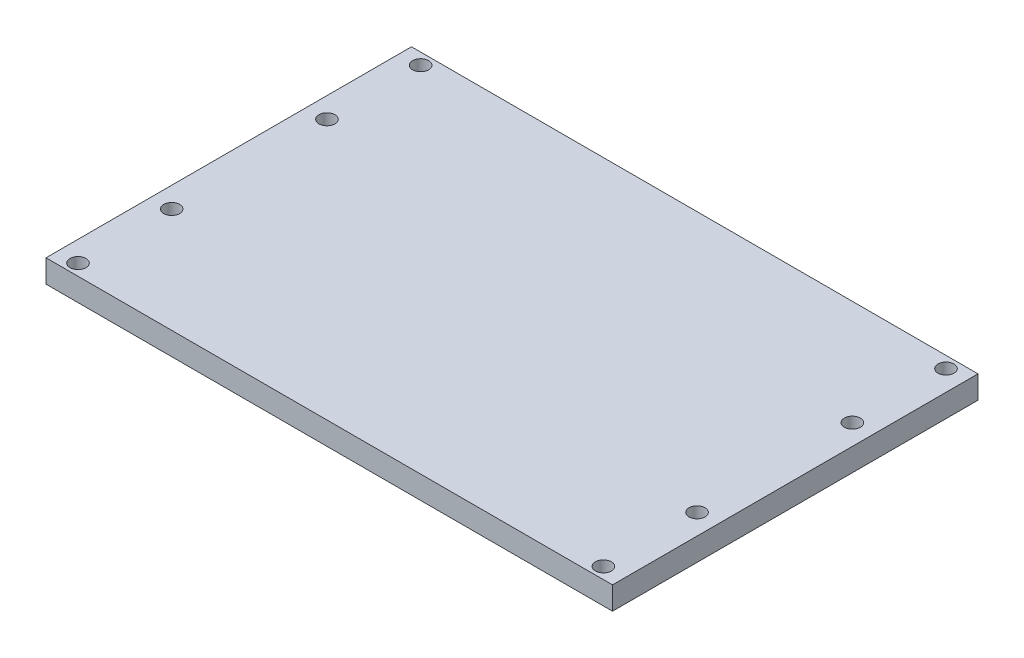
ISO-10303-21;
HEADER;
FILE_DESCRIPTION(('STEP AP214'),'2;1');
FILE_NAME('part.step','',(''),(''),'','','');
FILE_SCHEMA(('AUTOMOTIVE_DESIGN { 1 0 10303 214 1 1 1 1 }'));
ENDSEC;
DATA;
#1=APPLICATION_CONTEXT('core data for automotive mechanical design processes');
#2=APPLICATION_PROTOCOL_DEFINITION('international standard','automotive_design',2000,#1);
#3=PRODUCT_CONTEXT('',#1,'mechanical');
#4=PRODUCT('Part','Part','',(#3));
#5=PRODUCT_RELATED_PRODUCT_CATEGORY('part','',(#4));
#6=PRODUCT_DEFINITION_FORMATION('','',#4);
#7=PRODUCT_DEFINITION_CONTEXT('part definition',#1,'design');
#8=PRODUCT_DEFINITION('design','',#6,#7);
#9=PRODUCT_DEFINITION_SHAPE('','',#8);
#10=(LENGTH_UNIT() NAMED_UNIT(*) SI_UNIT(.MILLI.,.METRE.));
#11=(NAMED_UNIT(*) PLANE_ANGLE_UNIT() SI_UNIT($,.RADIAN.));
#12=(NAMED_UNIT(*) SI_UNIT($,.STERADIAN.) SOLID_ANGLE_UNIT());
#13=UNCERTAINTY_MEASURE_WITH_UNIT(LENGTH_MEASURE(1.E-05),#10,'distance_accuracy_value','');
#14=(GEOMETRIC_REPRESENTATION_CONTEXT(3) GLOBAL_UNCERTAINTY_ASSIGNED_CONTEXT((#13)) GLOBAL_UNIT_ASSIGNED_CONTEXT((#10,
#11,#12)) REPRESENTATION_CONTEXT('',''));
#15=CARTESIAN_POINT('',(0.,0.,0.));
#16=DIRECTION('',(0.,0.,1.));
#17=DIRECTION('',(1.,0.,0.));
#18=AXIS2_PLACEMENT_3D('',#15,#16,#17);
#19=CARTESIAN_POINT('',(-57.5,0.,-17.));
#20=DIRECTION('',(0.,1.,0.));
#21=DIRECTION('',(0.,0.,1.));
#22=AXIS2_PLACEMENT_3D('',#19,#20,#21);
#23=CYLINDRICAL_SURFACE('',#22,1.15);
#24=CARTESIAN_POINT('',(-57.5,0.,-17.));
#25=DIRECTION('',(0.,1.,0.));
#26=DIRECTION('',(0.,0.,1.));
#27=AXIS2_PLACEMENT_3D('',#24,#25,#26);
#28=CIRCLE('',#27,1.15);
#29=CARTESIAN_POINT('',(-57.5,0.,-15.85));
#30=VERTEX_POINT('',#29);
#31=EDGE_CURVE('E109',#30,#30,#28,.T.);
#32=ORIENTED_EDGE('',*,*,#31,.F.);
#33=EDGE_LOOP('',(#32));
#34=FACE_BOUND('',#33,.T.);
#35=CARTESIAN_POINT('',(-57.5,2.,-17.));
#36=DIRECTION('',(0.,1.,0.));
#37=DIRECTION('',(0.,0.,1.));
#38=AXIS2_PLACEMENT_3D('',#35,#36,#37);
#39=CIRCLE('',#38,1.15);
#40=CARTESIAN_POINT('',(-57.5,2.,-15.85));
#41=VERTEX_POINT('',#40);
#42=EDGE_CURVE('E43',#41,#41,#39,.F.);
#43=ORIENTED_EDGE('',*,*,#42,.F.);
#44=EDGE_LOOP('',(#43));
#45=FACE_BOUND('',#44,.T.);
#46=ADVANCED_FACE('F39',(#34,#45),#23,.F.);
#47=CARTESIAN_POINT('',(57.5,0.,37.5));
#48=DIRECTION('',(0.,1.,0.));
#49=DIRECTION('',(0.,0.,1.));
#50=AXIS2_PLACEMENT_3D('',#47,#48,#49);
#51=CYLINDRICAL_SURFACE('',#50,1.15);
#52=CARTESIAN_POINT('',(57.5,0.,37.5));
#53=DIRECTION('',(0.,1.,0.));
#54=DIRECTION('',(0.,0.,1.));
#55=AXIS2_PLACEMENT_3D('',#52,#53,#54);
#56=CIRCLE('',#55,1.15);
#57=CARTESIAN_POINT('',(57.5,0.,38.65));
#58=VERTEX_POINT('',#57);
#59=EDGE_CURVE('E138',#58,#58,#56,.T.);
#60=ORIENTED_EDGE('',*,*,#59,.F.);
#61=EDGE_LOOP('',(#60));
#62=FACE_BOUND('',#61,.T.);
#63=CARTESIAN_POINT('',(57.5,2.,37.5));
#64=DIRECTION('',(0.,1.,0.));
#65=DIRECTION('',(0.,0.,1.));
#66=AXIS2_PLACEMENT_3D('',#63,#64,#65);
#67=CIRCLE('',#66,1.15);
#68=CARTESIAN_POINT('',(57.5,2.,38.65));
#69=VERTEX_POINT('',#68);
#70=EDGE_CURVE('E133',#69,#69,#67,.F.);
#71=ORIENTED_EDGE('',*,*,#70,.F.);
#72=EDGE_LOOP('',(#71));
#73=FACE_BOUND('',#72,.T.);
#74=ADVANCED_FACE('F171',(#62,#73),#51,.F.);
#75=CARTESIAN_POINT('',(57.5,0.,17.));
#76=DIRECTION('',(0.,1.,0.));
#77=DIRECTION('',(0.,0.,1.));
#78=AXIS2_PLACEMENT_3D('',#75,#76,#77);
#79=CYLINDRICAL_SURFACE('',#78,1.15);
#80=CARTESIAN_POINT('',(57.5,0.,17.));
#81=DIRECTION('',(0.,1.,0.));
#82=DIRECTION('',(0.,0.,1.));
#83=AXIS2_PLACEMENT_3D('',#80,#81,#82);
#84=CIRCLE('',#83,1.15);
#85=CARTESIAN_POINT('',(57.5,0.,18.15));
#86=VERTEX_POINT('',#85);
#87=EDGE_CURVE('E142',#86,#86,#84,.T.);
#88=ORIENTED_EDGE('',*,*,#87,.F.);
#89=EDGE_LOOP('',(#88));
#90=FACE_BOUND('',#89,.T.);
#91=CARTESIAN_POINT('',(57.5,2.,17.));
#92=DIRECTION('',(0.,1.,0.));
#93=DIRECTION('',(0.,0.,1.));
#94=AXIS2_PLACEMENT_3D('',#91,#92,#93);
#95=CIRCLE('',#94,1.15);
#96=CARTESIAN_POINT('',(57.5,2.,18.15));
#97=VERTEX_POINT('',#96);
#98=EDGE_CURVE('E131',#97,#97,#95,.F.);
#99=ORIENTED_EDGE('',*,*,#98,.F.);
#100=EDGE_LOOP('',(#99));
#101=FACE_BOUND('',#100,.T.);
#102=ADVANCED_FACE('F176',(#90,#101),#79,.F.);
#103=CARTESIAN_POINT('',(57.5,0.,-17.));
#104=DIRECTION('',(0.,1.,0.));
#105=DIRECTION('',(0.,0.,1.));
#106=AXIS2_PLACEMENT_3D('',#103,#104,#105);
#107=CYLINDRICAL_SURFACE('',#106,1.15);
#108=CARTESIAN_POINT('',(57.5,0.,-17.));
#109=DIRECTION('',(0.,1.,0.));
#110=DIRECTION('',(0.,0.,1.));
#111=AXIS2_PLACEMENT_3D('',#108,#109,#110);
#112=CIRCLE('',#111,1.15);
#113=CARTESIAN_POINT('',(57.5,0.,-15.85));
#114=VERTEX_POINT('',#113);
#115=EDGE_CURVE('E147',#114,#114,#112,.T.);
#116=ORIENTED_EDGE('',*,*,#115,.F.);
#117=EDGE_LOOP('',(#116));
#118=FACE_BOUND('',#117,.T.);
#119=CARTESIAN_POINT('',(57.5,2.,-17.));
#120=DIRECTION('',(0.,1.,0.));
#121=DIRECTION('',(0.,0.,1.));
#122=AXIS2_PLACEMENT_3D('',#119,#120,#121);
#123=CIRCLE('',#122,1.15);
#124=CARTESIAN_POINT('',(57.5,2.,-15.85));
#125=VERTEX_POINT('',#124);
#126=EDGE_CURVE('E128',#125,#125,#123,.F.);
#127=ORIENTED_EDGE('',*,*,#126,.F.);
#128=EDGE_LOOP('',(#127));
#129=FACE_BOUND('',#128,.T.);
#130=ADVANCED_FACE('F221',(#118,#129),#107,.F.);
#131=CARTESIAN_POINT('',(57.5,0.,-37.5));
#132=DIRECTION('',(0.,1.,0.));
#133=DIRECTION('',(0.,0.,1.));
#134=AXIS2_PLACEMENT_3D('',#131,#132,#133);
#135=CYLINDRICAL_SURFACE('',#134,1.15);
#136=CARTESIAN_POINT('',(57.5,0.,-37.5));
#137=DIRECTION('',(0.,1.,0.));
#138=DIRECTION('',(0.,0.,1.));
#139=AXIS2_PLACEMENT_3D('',#136,#137,#138);
#140=CIRCLE('',#139,1.15);
#141=CARTESIAN_POINT('',(57.5,0.,-36.35));
#142=VERTEX_POINT('',#141);
#143=EDGE_CURVE('E160',#142,#142,#140,.T.);
#144=ORIENTED_EDGE('',*,*,#143,.F.);
#145=EDGE_LOOP('',(#144));
#146=FACE_BOUND('',#145,.T.);
#147=CARTESIAN_POINT('',(57.5,2.,-37.5));
#148=DIRECTION('',(0.,1.,0.));
#149=DIRECTION('',(0.,0.,1.));
#150=AXIS2_PLACEMENT_3D('',#147,#148,#149);
#151=CIRCLE('',#150,1.15);
#152=CARTESIAN_POINT('',(57.5,2.,-36.35));
#153=VERTEX_POINT('',#152);
#154=EDGE_CURVE('E125',#153,#153,#151,.F.);
#155=ORIENTED_EDGE('',*,*,#154,.F.);
#156=EDGE_LOOP('',(#155));
#157=FACE_BOUND('',#156,.T.);
#158=ADVANCED_FACE('F181',(#146,#157),#135,.F.);
#159=CARTESIAN_POINT('',(-57.5,0.,-37.5));
#160=DIRECTION('',(0.,1.,0.));
#161=DIRECTION('',(0.,0.,1.));
#162=AXIS2_PLACEMENT_3D('',#159,#160,#161);
#163=CYLINDRICAL_SURFACE('',#162,1.15);
#164=CARTESIAN_POINT('',(-57.5,0.,-37.5));
#165=DIRECTION('',(0.,1.,0.));
#166=DIRECTION('',(0.,0.,1.));
#167=AXIS2_PLACEMENT_3D('',#164,#165,#166);
#168=CIRCLE('',#167,1.15);
#169=CARTESIAN_POINT('',(-57.5,0.,-36.35));
#170=VERTEX_POINT('',#169);
#171=EDGE_CURVE('E157',#170,#170,#168,.T.);
#172=ORIENTED_EDGE('',*,*,#171,.F.);
#173=EDGE_LOOP('',(#172));
#174=FACE_BOUND('',#173,.T.);
#175=CARTESIAN_POINT('',(-57.5,2.,-37.5));
#176=DIRECTION('',(0.,1.,0.));
#177=DIRECTION('',(0.,0.,1.));
#178=AXIS2_PLACEMENT_3D('',#175,#176,#177);
#179=CIRCLE('',#178,1.15);
#180=CARTESIAN_POINT('',(-57.5,2.,-36.35));
#181=VERTEX_POINT('',#180);
#182=EDGE_CURVE('E122',#181,#181,#179,.F.);
#183=ORIENTED_EDGE('',*,*,#182,.F.);
#184=EDGE_LOOP('',(#183));
#185=FACE_BOUND('',#184,.T.);
#186=ADVANCED_FACE('F210',(#174,#185),#163,.F.);
#187=CARTESIAN_POINT('',(-57.5,0.,37.5));
#188=DIRECTION('',(0.,1.,0.));
#189=DIRECTION('',(0.,0.,1.));
#190=AXIS2_PLACEMENT_3D('',#187,#188,#189);
#191=CYLINDRICAL_SURFACE('',#190,1.15);
#192=CARTESIAN_POINT('',(-57.5,0.,37.5));
#193=DIRECTION('',(0.,1.,0.));
#194=DIRECTION('',(0.,0.,1.));
#195=AXIS2_PLACEMENT_3D('',#192,#193,#194);
#196=CIRCLE('',#195,1.15);
#197=CARTESIAN_POINT('',(-57.5,0.,38.65));
#198=VERTEX_POINT('',#197);
#199=EDGE_CURVE('E154',#198,#198,#196,.T.);
#200=ORIENTED_EDGE('',*,*,#199,.F.);
#201=EDGE_LOOP('',(#200));
#202=FACE_BOUND('',#201,.T.);
#203=CARTESIAN_POINT('',(-57.5,2.,37.5));
#204=DIRECTION('',(0.,1.,0.));
#205=DIRECTION('',(0.,0.,1.));
#206=AXIS2_PLACEMENT_3D('',#203,#204,#205);
#207=CIRCLE('',#206,1.15);
#208=CARTESIAN_POINT('',(-57.5,2.,38.65));
#209=VERTEX_POINT('',#208);
#210=EDGE_CURVE('E118',#209,#209,#207,.F.);
#211=ORIENTED_EDGE('',*,*,#210,.F.);
#212=EDGE_LOOP('',(#211));
#213=FACE_BOUND('',#212,.T.);
#214=ADVANCED_FACE('F203',(#202,#213),#191,.F.);
#215=CARTESIAN_POINT('',(-57.5,0.,17.));
#216=DIRECTION('',(0.,1.,0.));
#217=DIRECTION('',(0.,0.,1.));
#218=AXIS2_PLACEMENT_3D('',#215,#216,#217);
#219=CYLINDRICAL_SURFACE('',#218,1.15);
#220=CARTESIAN_POINT('',(-57.5,0.,17.));
#221=DIRECTION('',(0.,1.,0.));
#222=DIRECTION('',(0.,0.,1.));
#223=AXIS2_PLACEMENT_3D('',#220,#221,#222);
#224=CIRCLE('',#223,1.15);
#225=CARTESIAN_POINT('',(-57.5,0.,18.15));
#226=VERTEX_POINT('',#225);
#227=EDGE_CURVE('E151',#226,#226,#224,.T.);
#228=ORIENTED_EDGE('',*,*,#227,.F.);
#229=EDGE_LOOP('',(#228));
#230=FACE_BOUND('',#229,.T.);
#231=CARTESIAN_POINT('',(-57.5,2.,17.));
#232=DIRECTION('',(0.,1.,0.));
#233=DIRECTION('',(0.,0.,1.));
#234=AXIS2_PLACEMENT_3D('',#231,#232,#233);
#235=CIRCLE('',#234,1.15);
#236=CARTESIAN_POINT('',(-57.5,2.,18.15));
#237=VERTEX_POINT('',#236);
#238=EDGE_CURVE('E115',#237,#237,#235,.F.);
#239=ORIENTED_EDGE('',*,*,#238,.F.);
#240=EDGE_LOOP('',(#239));
#241=FACE_BOUND('',#240,.T.);
#242=ADVANCED_FACE('F198',(#230,#241),#219,.F.);
#243=CARTESIAN_POINT('',(62.,5.,40.));
#244=DIRECTION('',(-1.,0.,0.));
#245=DIRECTION('',(0.,0.,1.));
#246=AXIS2_PLACEMENT_3D('',#243,#244,#245);
#247=PLANE('',#246);
#248=DIRECTION('',(0.,0.,-1.));
#249=VECTOR('',#248,1.);
#250=CARTESIAN_POINT('',(62.,0.,40.));
#251=LINE('',#250,#249);
#252=CARTESIAN_POINT('',(62.,0.,40.));
#253=VERTEX_POINT('',#252);
#254=CARTESIAN_POINT('',(62.,0.,-40.));
#255=VERTEX_POINT('',#254);
#256=EDGE_CURVE('E106',#253,#255,#251,.T.);
#257=ORIENTED_EDGE('',*,*,#256,.T.);
#258=DIRECTION('',(0.,-1.,0.));
#259=VECTOR('',#258,1.);
#260=CARTESIAN_POINT('',(62.,5.,-40.));
#261=LINE('',#260,#259);
#262=CARTESIAN_POINT('',(62.,5.,-40.));
#263=VERTEX_POINT('',#262);
#264=EDGE_CURVE('E11',#263,#255,#261,.T.);
#265=ORIENTED_EDGE('',*,*,#264,.F.);
#266=DIRECTION('',(0.,0.,-1.));
#267=VECTOR('',#266,1.);
#268=CARTESIAN_POINT('',(62.,5.,40.));
#269=LINE('',#268,#267);
#270=CARTESIAN_POINT('',(62.,5.,40.));
#271=VERTEX_POINT('',#270);
#272=EDGE_CURVE('E93',#271,#263,#269,.T.);
#273=ORIENTED_EDGE('',*,*,#272,.F.);
#274=DIRECTION('',(0.,-1.,0.));
#275=VECTOR('',#274,1.);
#276=CARTESIAN_POINT('',(62.,5.,40.));
#277=LINE('',#276,#275);
#278=EDGE_CURVE('E102',#271,#253,#277,.T.);
#279=ORIENTED_EDGE('',*,*,#278,.T.);
#280=EDGE_LOOP('',(#257,#265,#273,#279));
#281=FACE_BOUND('',#280,.T.);
#282=ADVANCED_FACE('F41',(#281),#247,.F.);
#283=CARTESIAN_POINT('',(-62.,5.,-40.));
#284=DIRECTION('',(0.,0.,1.));
#285=DIRECTION('',(1.,0.,0.));
#286=AXIS2_PLACEMENT_3D('',#283,#284,#285);
#287=PLANE('',#286);
#288=DIRECTION('',(-1.,0.,0.));
#289=VECTOR('',#288,1.);
#290=CARTESIAN_POINT('',(-62.,0.,-40.));
#291=LINE('',#290,#289);
#292=CARTESIAN_POINT('',(-62.,0.,-40.));
#293=VERTEX_POINT('',#292);
#294=EDGE_CURVE('E97',#255,#293,#291,.T.);
#295=ORIENTED_EDGE('',*,*,#294,.T.);
#296=DIRECTION('',(0.,-1.,0.));
#297=VECTOR('',#296,1.);
#298=CARTESIAN_POINT('',(-62.,5.,-40.));
#299=LINE('',#298,#297);
#300=CARTESIAN_POINT('',(-62.,5.,-40.));
#301=VERTEX_POINT('',#300);
#302=EDGE_CURVE('E49',#301,#293,#299,.T.);
#303=ORIENTED_EDGE('',*,*,#302,.F.);
#304=DIRECTION('',(-1.,0.,0.));
#305=VECTOR('',#304,1.);
#306=CARTESIAN_POINT('',(-62.,5.,-40.));
#307=LINE('',#306,#305);
#308=EDGE_CURVE('E88',#263,#301,#307,.T.);
#309=ORIENTED_EDGE('',*,*,#308,.F.);
#310=ORIENTED_EDGE('',*,*,#264,.T.);
#311=EDGE_LOOP('',(#295,#303,#309,#310));
#312=FACE_BOUND('',#311,.T.);
#313=ADVANCED_FACE('F96',(#312),#287,.F.);
#314=CARTESIAN_POINT('',(-62.,5.,40.));
#315=DIRECTION('',(1.,0.,0.));
#316=DIRECTION('',(0.,0.,-1.));
#317=AXIS2_PLACEMENT_3D('',#314,#315,#316);
#318=PLANE('',#317);
#319=DIRECTION('',(0.,0.,1.));
#320=VECTOR('',#319,1.);
#321=CARTESIAN_POINT('',(-62.,0.,40.));
#322=LINE('',#321,#320);
#323=CARTESIAN_POINT('',(-62.,0.,40.));
#324=VERTEX_POINT('',#323);
#325=EDGE_CURVE('E75',#293,#324,#322,.T.);
#326=ORIENTED_EDGE('',*,*,#325,.T.);
#327=DIRECTION('',(0.,-1.,0.));
#328=VECTOR('',#327,1.);
#329=CARTESIAN_POINT('',(-62.,5.,40.));
#330=LINE('',#329,#328);
#331=CARTESIAN_POINT('',(-62.,5.,40.));
#332=VERTEX_POINT('',#331);
#333=EDGE_CURVE('E98',#332,#324,#330,.T.);
#334=ORIENTED_EDGE('',*,*,#333,.F.);
#335=DIRECTION('',(0.,0.,1.));
#336=VECTOR('',#335,1.);
#337=CARTESIAN_POINT('',(-62.,5.,40.));
#338=LINE('',#337,#336);
#339=EDGE_CURVE('E91',#301,#332,#338,.T.);
#340=ORIENTED_EDGE('',*,*,#339,.F.);
#341=ORIENTED_EDGE('',*,*,#302,.T.);
#342=EDGE_LOOP('',(#326,#334,#340,#341));
#343=FACE_BOUND('',#342,.T.);
#344=ADVANCED_FACE('F100',(#343),#318,.F.);
#345=CARTESIAN_POINT('',(-62.,5.,40.));
#346=DIRECTION('',(0.,0.,-1.));
#347=DIRECTION('',(-1.,0.,0.));
#348=AXIS2_PLACEMENT_3D('',#345,#346,#347);
#349=PLANE('',#348);
#350=DIRECTION('',(1.,0.,0.));
#351=VECTOR('',#350,1.);
#352=CARTESIAN_POINT('',(-62.,0.,40.));
#353=LINE('',#352,#351);
#354=EDGE_CURVE('E81',#324,#253,#353,.T.);
#355=ORIENTED_EDGE('',*,*,#354,.T.);
#356=ORIENTED_EDGE('',*,*,#278,.F.);
#357=DIRECTION('',(1.,0.,0.));
#358=VECTOR('',#357,1.);
#359=CARTESIAN_POINT('',(-62.,5.,40.));
#360=LINE('',#359,#358);
#361=EDGE_CURVE('E58',#332,#271,#360,.T.);
#362=ORIENTED_EDGE('',*,*,#361,.F.);
#363=ORIENTED_EDGE('',*,*,#333,.T.);
#364=EDGE_LOOP('',(#355,#356,#362,#363));
#365=FACE_BOUND('',#364,.T.);
#366=ADVANCED_FACE('F185',(#365),#349,.F.);
#367=CARTESIAN_POINT('',(0.,5.,0.));
#368=DIRECTION('',(0.,-1.,0.));
#369=DIRECTION('',(0.,0.,-1.));
#370=AXIS2_PLACEMENT_3D('',#367,#368,#369);
#371=PLANE('',#370);
#372=CARTESIAN_POINT('',(-57.5,5.,-17.));
#373=DIRECTION('',(0.,1.,0.));
#374=DIRECTION('',(0.,0.,1.));
#375=AXIS2_PLACEMENT_3D('',#372,#373,#374);
#376=CIRCLE('',#375,1.75);
#377=CARTESIAN_POINT('',(-57.5,5.,-15.25));
#378=VERTEX_POINT('',#377);
#379=EDGE_CURVE('E329',#378,#378,#376,.T.);
#380=ORIENTED_EDGE('',*,*,#379,.F.);
#381=EDGE_LOOP('',(#380));
#382=FACE_BOUND('',#381,.T.);
#383=CARTESIAN_POINT('',(-57.5,5.,17.));
#384=DIRECTION('',(0.,1.,0.));
#385=DIRECTION('',(0.,0.,1.));
#386=AXIS2_PLACEMENT_3D('',#383,#384,#385);
#387=CIRCLE('',#386,1.75);
#388=CARTESIAN_POINT('',(-57.5,5.,18.75));
#389=VERTEX_POINT('',#388);
#390=EDGE_CURVE('E345',#389,#389,#387,.T.);
#391=ORIENTED_EDGE('',*,*,#390,.F.);
#392=EDGE_LOOP('',(#391));
#393=FACE_BOUND('',#392,.T.);
#394=CARTESIAN_POINT('',(-57.5,5.,37.5));
#395=DIRECTION('',(0.,1.,0.));
#396=DIRECTION('',(0.,0.,1.));
#397=AXIS2_PLACEMENT_3D('',#394,#395,#396);
#398=CIRCLE('',#397,1.75);
#399=CARTESIAN_POINT('',(-57.5,5.,39.25));
#400=VERTEX_POINT('',#399);
#401=EDGE_CURVE('E320',#400,#400,#398,.T.);
#402=ORIENTED_EDGE('',*,*,#401,.F.);
#403=EDGE_LOOP('',(#402));
#404=FACE_BOUND('',#403,.T.);
#405=CARTESIAN_POINT('',(57.5,5.,37.5));
#406=DIRECTION('',(0.,1.,0.));
#407=DIRECTION('',(0.,0.,1.));
#408=AXIS2_PLACEMENT_3D('',#405,#406,#407);
#409=CIRCLE('',#408,1.75);
#410=CARTESIAN_POINT('',(57.5,5.,39.25));
#411=VERTEX_POINT('',#410);
#412=EDGE_CURVE('E315',#411,#411,#409,.T.);
#413=ORIENTED_EDGE('',*,*,#412,.F.);
#414=EDGE_LOOP('',(#413));
#415=FACE_BOUND('',#414,.T.);
#416=CARTESIAN_POINT('',(57.5,5.,17.));
#417=DIRECTION('',(0.,1.,0.));
#418=DIRECTION('',(0.,0.,1.));
#419=AXIS2_PLACEMENT_3D('',#416,#417,#418);
#420=CIRCLE('',#419,1.75);
#421=CARTESIAN_POINT('',(57.5,5.,18.75));
#422=VERTEX_POINT('',#421);
#423=EDGE_CURVE('E322',#422,#422,#420,.T.);
#424=ORIENTED_EDGE('',*,*,#423,.F.);
#425=EDGE_LOOP('',(#424));
#426=FACE_BOUND('',#425,.T.);
#427=CARTESIAN_POINT('',(57.5,5.,-17.));
#428=DIRECTION('',(0.,1.,0.));
#429=DIRECTION('',(0.,0.,1.));
#430=AXIS2_PLACEMENT_3D('',#427,#428,#429);
#431=CIRCLE('',#430,1.75);
#432=CARTESIAN_POINT('',(57.5,5.,-15.25));
#433=VERTEX_POINT('',#432);
#434=EDGE_CURVE('E366',#433,#433,#431,.T.);
#435=ORIENTED_EDGE('',*,*,#434,.F.);
#436=EDGE_LOOP('',(#435));
#437=FACE_BOUND('',#436,.T.);
#438=CARTESIAN_POINT('',(57.5,5.,-37.5));
#439=DIRECTION('',(0.,1.,0.));
#440=DIRECTION('',(0.,0.,1.));
#441=AXIS2_PLACEMENT_3D('',#438,#439,#440);
#442=CIRCLE('',#441,1.75);
#443=CARTESIAN_POINT('',(57.5,5.,-35.75));
#444=VERTEX_POINT('',#443);
#445=EDGE_CURVE('E370',#444,#444,#442,.T.);
#446=ORIENTED_EDGE('',*,*,#445,.F.);
#447=EDGE_LOOP('',(#446));
#448=FACE_BOUND('',#447,.T.);
#449=CARTESIAN_POINT('',(-57.5,5.,-37.5));
#450=DIRECTION('',(0.,1.,0.));
#451=DIRECTION('',(0.,0.,1.));
#452=AXIS2_PLACEMENT_3D('',#449,#450,#451);
#453=CIRCLE('',#452,1.75);
#454=CARTESIAN_POINT('',(-57.5,5.,-35.75));
#455=VERTEX_POINT('',#454);
#456=EDGE_CURVE('E327',#455,#455,#453,.T.);
#457=ORIENTED_EDGE('',*,*,#456,.F.);
#458=EDGE_LOOP('',(#457));
#459=FACE_BOUND('',#458,.T.);
#460=ORIENTED_EDGE('',*,*,#272,.T.);
#461=ORIENTED_EDGE('',*,*,#308,.T.);
#462=ORIENTED_EDGE('',*,*,#339,.T.);
#463=ORIENTED_EDGE('',*,*,#361,.T.);
#464=EDGE_LOOP('',(#460,#461,#462,#463));
#465=FACE_BOUND('',#464,.T.);
#466=ADVANCED_FACE('F89',(#382,#393,#404,#415,#426,#437,#448,#459,#465),#371,.F.);
#467=CARTESIAN_POINT('',(0.,0.,0.));
#468=DIRECTION('',(0.,-1.,0.));
#469=DIRECTION('',(0.,0.,-1.));
#470=AXIS2_PLACEMENT_3D('',#467,#468,#469);
#471=PLANE('',#470);
#472=ORIENTED_EDGE('',*,*,#227,.T.);
#473=EDGE_LOOP('',(#472));
#474=FACE_BOUND('',#473,.T.);
#475=ORIENTED_EDGE('',*,*,#199,.T.);
#476=EDGE_LOOP('',(#475));
#477=FACE_BOUND('',#476,.T.);
#478=ORIENTED_EDGE('',*,*,#171,.T.);
#479=EDGE_LOOP('',(#478));
#480=FACE_BOUND('',#479,.T.);
#481=ORIENTED_EDGE('',*,*,#143,.T.);
#482=EDGE_LOOP('',(#481));
#483=FACE_BOUND('',#482,.T.);
#484=ORIENTED_EDGE('',*,*,#115,.T.);
#485=EDGE_LOOP('',(#484));
#486=FACE_BOUND('',#485,.T.);
#487=ORIENTED_EDGE('',*,*,#87,.T.);
#488=EDGE_LOOP('',(#487));
#489=FACE_BOUND('',#488,.T.);
#490=ORIENTED_EDGE('',*,*,#59,.T.);
#491=EDGE_LOOP('',(#490));
#492=FACE_BOUND('',#491,.T.);
#493=ORIENTED_EDGE('',*,*,#31,.T.);
#494=EDGE_LOOP('',(#493));
#495=FACE_BOUND('',#494,.T.);
#496=ORIENTED_EDGE('',*,*,#256,.F.);
#497=ORIENTED_EDGE('',*,*,#354,.F.);
#498=ORIENTED_EDGE('',*,*,#325,.F.);
#499=ORIENTED_EDGE('',*,*,#294,.F.);
#500=EDGE_LOOP('',(#496,#497,#498,#499));
#501=FACE_BOUND('',#500,.T.);
#502=ADVANCED_FACE('F166',(#474,#477,#480,#483,#486,#489,#492,#495,#501),#471,.T.);
#503=CARTESIAN_POINT('',(-57.5,2.,17.));
#504=DIRECTION('',(0.,1.,0.));
#505=DIRECTION('',(0.,0.,1.));
#506=AXIS2_PLACEMENT_3D('',#503,#504,#505);
#507=PLANE('',#506);
#508=CARTESIAN_POINT('',(-57.5,2.,17.));
#509=DIRECTION('',(0.,1.,0.));
#510=DIRECTION('',(0.,0.,1.));
#511=AXIS2_PLACEMENT_3D('',#508,#509,#510);
#512=CIRCLE('',#511,1.75);
#513=CARTESIAN_POINT('',(-57.5,2.,18.75));
#514=VERTEX_POINT('',#513);
#515=EDGE_CURVE('E353',#514,#514,#512,.T.);
#516=ORIENTED_EDGE('',*,*,#515,.T.);
#517=EDGE_LOOP('',(#516));
#518=FACE_BOUND('',#517,.T.);
#519=ORIENTED_EDGE('',*,*,#238,.T.);
#520=EDGE_LOOP('',(#519));
#521=FACE_BOUND('',#520,.T.);
#522=ADVANCED_FACE('F189',(#518,#521),#507,.T.);
#523=CARTESIAN_POINT('',(-57.5,2.,17.));
#524=DIRECTION('',(0.,1.,0.));
#525=DIRECTION('',(0.,0.,1.));
#526=AXIS2_PLACEMENT_3D('',#523,#524,#525);
#527=CYLINDRICAL_SURFACE('',#526,1.75);
#528=ORIENTED_EDGE('',*,*,#515,.F.);
#529=EDGE_LOOP('',(#528));
#530=FACE_BOUND('',#529,.T.);
#531=ORIENTED_EDGE('',*,*,#390,.T.);
#532=EDGE_LOOP('',(#531));
#533=FACE_BOUND('',#532,.T.);
#534=ADVANCED_FACE('F294',(#530,#533),#527,.F.);
#535=CARTESIAN_POINT('',(-57.5,2.,37.5));
#536=DIRECTION('',(0.,1.,0.));
#537=DIRECTION('',(0.,0.,1.));
#538=AXIS2_PLACEMENT_3D('',#535,#536,#537);
#539=PLANE('',#538);
#540=CARTESIAN_POINT('',(-57.5,2.,37.5));
#541=DIRECTION('',(0.,1.,0.));
#542=DIRECTION('',(0.,0.,1.));
#543=AXIS2_PLACEMENT_3D('',#540,#541,#542);
#544=CIRCLE('',#543,1.75);
#545=CARTESIAN_POINT('',(-57.5,2.,39.25));
#546=VERTEX_POINT('',#545);
#547=EDGE_CURVE('E317',#546,#546,#544,.T.);
#548=ORIENTED_EDGE('',*,*,#547,.T.);
#549=EDGE_LOOP('',(#548));
#550=FACE_BOUND('',#549,.T.);
#551=ORIENTED_EDGE('',*,*,#210,.T.);
#552=EDGE_LOOP('',(#551));
#553=FACE_BOUND('',#552,.T.);
#554=ADVANCED_FACE('F240',(#550,#553),#539,.T.);
#555=CARTESIAN_POINT('',(-57.5,2.,37.5));
#556=DIRECTION('',(0.,1.,0.));
#557=DIRECTION('',(0.,0.,1.));
#558=AXIS2_PLACEMENT_3D('',#555,#556,#557);
#559=CYLINDRICAL_SURFACE('',#558,1.75);
#560=ORIENTED_EDGE('',*,*,#547,.F.);
#561=EDGE_LOOP('',(#560));
#562=FACE_BOUND('',#561,.T.);
#563=ORIENTED_EDGE('',*,*,#401,.T.);
#564=EDGE_LOOP('',(#563));
#565=FACE_BOUND('',#564,.T.);
#566=ADVANCED_FACE('F230',(#562,#565),#559,.F.);
#567=CARTESIAN_POINT('',(-57.5,2.,-37.5));
#568=DIRECTION('',(0.,1.,0.));
#569=DIRECTION('',(0.,0.,1.));
#570=AXIS2_PLACEMENT_3D('',#567,#568,#569);
#571=PLANE('',#570);
#572=CARTESIAN_POINT('',(-57.5,2.,-37.5));
#573=DIRECTION('',(0.,1.,0.));
#574=DIRECTION('',(0.,0.,1.));
#575=AXIS2_PLACEMENT_3D('',#572,#573,#574);
#576=CIRCLE('',#575,1.75);
#577=CARTESIAN_POINT('',(-57.5,2.,-35.75));
#578=VERTEX_POINT('',#577);
#579=EDGE_CURVE('E119',#578,#578,#576,.T.);
#580=ORIENTED_EDGE('',*,*,#579,.T.);
#581=EDGE_LOOP('',(#580));
#582=FACE_BOUND('',#581,.T.);
#583=ORIENTED_EDGE('',*,*,#182,.T.);
#584=EDGE_LOOP('',(#583));
#585=FACE_BOUND('',#584,.T.);
#586=ADVANCED_FACE('F227',(#582,#585),#571,.T.);
#587=CARTESIAN_POINT('',(-57.5,2.,-37.5));
#588=DIRECTION('',(0.,1.,0.));
#589=DIRECTION('',(0.,0.,1.));
#590=AXIS2_PLACEMENT_3D('',#587,#588,#589);
#591=CYLINDRICAL_SURFACE('',#590,1.75);
#592=ORIENTED_EDGE('',*,*,#579,.F.);
#593=EDGE_LOOP('',(#592));
#594=FACE_BOUND('',#593,.T.);
#595=ORIENTED_EDGE('',*,*,#456,.T.);
#596=EDGE_LOOP('',(#595));
#597=FACE_BOUND('',#596,.T.);
#598=ADVANCED_FACE('F229',(#594,#597),#591,.F.);
#599=CARTESIAN_POINT('',(57.5,2.,-37.5));
#600=DIRECTION('',(0.,1.,0.));
#601=DIRECTION('',(0.,0.,1.));
#602=AXIS2_PLACEMENT_3D('',#599,#600,#601);
#603=PLANE('',#602);
#604=CARTESIAN_POINT('',(57.5,2.,-37.5));
#605=DIRECTION('',(0.,1.,0.));
#606=DIRECTION('',(0.,0.,1.));
#607=AXIS2_PLACEMENT_3D('',#604,#605,#606);
#608=CIRCLE('',#607,1.75);
#609=CARTESIAN_POINT('',(57.5,2.,-35.75));
#610=VERTEX_POINT('',#609);
#611=EDGE_CURVE('E348',#610,#610,#608,.T.);
#612=ORIENTED_EDGE('',*,*,#611,.T.);
#613=EDGE_LOOP('',(#612));
#614=FACE_BOUND('',#613,.T.);
#615=ORIENTED_EDGE('',*,*,#154,.T.);
#616=EDGE_LOOP('',(#615));
#617=FACE_BOUND('',#616,.T.);
#618=ADVANCED_FACE('F237',(#614,#617),#603,.T.);
#619=CARTESIAN_POINT('',(57.5,2.,-37.5));
#620=DIRECTION('',(0.,1.,0.));
#621=DIRECTION('',(0.,0.,1.));
#622=AXIS2_PLACEMENT_3D('',#619,#620,#621);
#623=CYLINDRICAL_SURFACE('',#622,1.75);
#624=ORIENTED_EDGE('',*,*,#611,.F.);
#625=EDGE_LOOP('',(#624));
#626=FACE_BOUND('',#625,.T.);
#627=ORIENTED_EDGE('',*,*,#445,.T.);
#628=EDGE_LOOP('',(#627));
#629=FACE_BOUND('',#628,.T.);
#630=ADVANCED_FACE('F277',(#626,#629),#623,.F.);
#631=CARTESIAN_POINT('',(57.5,2.,-17.));
#632=DIRECTION('',(0.,1.,0.));
#633=DIRECTION('',(0.,0.,1.));
#634=AXIS2_PLACEMENT_3D('',#631,#632,#633);
#635=PLANE('',#634);
#636=CARTESIAN_POINT('',(57.5,2.,-17.));
#637=DIRECTION('',(0.,1.,0.));
#638=DIRECTION('',(0.,0.,1.));
#639=AXIS2_PLACEMENT_3D('',#636,#637,#638);
#640=CIRCLE('',#639,1.75);
#641=CARTESIAN_POINT('',(57.5,2.,-15.25));
#642=VERTEX_POINT('',#641);
#643=EDGE_CURVE('E372',#642,#642,#640,.T.);
#644=ORIENTED_EDGE('',*,*,#643,.T.);
#645=EDGE_LOOP('',(#644));
#646=FACE_BOUND('',#645,.T.);
#647=ORIENTED_EDGE('',*,*,#126,.T.);
#648=EDGE_LOOP('',(#647));
#649=FACE_BOUND('',#648,.T.);
#650=ADVANCED_FACE('F270',(#646,#649),#635,.T.);
#651=CARTESIAN_POINT('',(57.5,2.,-17.));
#652=DIRECTION('',(0.,1.,0.));
#653=DIRECTION('',(0.,0.,1.));
#654=AXIS2_PLACEMENT_3D('',#651,#652,#653);
#655=CYLINDRICAL_SURFACE('',#654,1.75);
#656=ORIENTED_EDGE('',*,*,#643,.F.);
#657=EDGE_LOOP('',(#656));
#658=FACE_BOUND('',#657,.T.);
#659=ORIENTED_EDGE('',*,*,#434,.T.);
#660=EDGE_LOOP('',(#659));
#661=FACE_BOUND('',#660,.T.);
#662=ADVANCED_FACE('F261',(#658,#661),#655,.F.);
#663=CARTESIAN_POINT('',(57.5,2.,17.));
#664=DIRECTION('',(0.,1.,0.));
#665=DIRECTION('',(0.,0.,1.));
#666=AXIS2_PLACEMENT_3D('',#663,#664,#665);
#667=PLANE('',#666);
#668=CARTESIAN_POINT('',(57.5,2.,17.));
#669=DIRECTION('',(0.,1.,0.));
#670=DIRECTION('',(0.,0.,1.));
#671=AXIS2_PLACEMENT_3D('',#668,#669,#670);
#672=CIRCLE('',#671,1.75);
#673=CARTESIAN_POINT('',(57.5,2.,18.75));
#674=VERTEX_POINT('',#673);
#675=EDGE_CURVE('E378',#674,#674,#672,.T.);
#676=ORIENTED_EDGE('',*,*,#675,.T.);
#677=EDGE_LOOP('',(#676));
#678=FACE_BOUND('',#677,.T.);
#679=ORIENTED_EDGE('',*,*,#98,.T.);
#680=EDGE_LOOP('',(#679));
#681=FACE_BOUND('',#680,.T.);
#682=ADVANCED_FACE('F258',(#678,#681),#667,.T.);
#683=CARTESIAN_POINT('',(57.5,2.,17.));
#684=DIRECTION('',(0.,1.,0.));
#685=DIRECTION('',(0.,0.,1.));
#686=AXIS2_PLACEMENT_3D('',#683,#684,#685);
#687=CYLINDRICAL_SURFACE('',#686,1.75);
#688=ORIENTED_EDGE('',*,*,#675,.F.);
#689=EDGE_LOOP('',(#688));
#690=FACE_BOUND('',#689,.T.);
#691=ORIENTED_EDGE('',*,*,#423,.T.);
#692=EDGE_LOOP('',(#691));
#693=FACE_BOUND('',#692,.T.);
#694=ADVANCED_FACE('F260',(#690,#693),#687,.F.);
#695=CARTESIAN_POINT('',(57.5,2.,37.5));
#696=DIRECTION('',(0.,1.,0.));
#697=DIRECTION('',(0.,0.,1.));
#698=AXIS2_PLACEMENT_3D('',#695,#696,#697);
#699=PLANE('',#698);
#700=CARTESIAN_POINT('',(57.5,2.,37.5));
#701=DIRECTION('',(0.,1.,0.));
#702=DIRECTION('',(0.,0.,1.));
#703=AXIS2_PLACEMENT_3D('',#700,#701,#702);
#704=CIRCLE('',#703,1.75);
#705=CARTESIAN_POINT('',(57.5,2.,39.25));
#706=VERTEX_POINT('',#705);
#707=EDGE_CURVE('E312',#706,#706,#704,.T.);
#708=ORIENTED_EDGE('',*,*,#707,.T.);
#709=EDGE_LOOP('',(#708));
#710=FACE_BOUND('',#709,.T.);
#711=ORIENTED_EDGE('',*,*,#70,.T.);
#712=EDGE_LOOP('',(#711));
#713=FACE_BOUND('',#712,.T.);
#714=ADVANCED_FACE('F245',(#710,#713),#699,.T.);
#715=CARTESIAN_POINT('',(57.5,2.,37.5));
#716=DIRECTION('',(0.,1.,0.));
#717=DIRECTION('',(0.,0.,1.));
#718=AXIS2_PLACEMENT_3D('',#715,#716,#717);
#719=CYLINDRICAL_SURFACE('',#718,1.75);
#720=ORIENTED_EDGE('',*,*,#707,.F.);
#721=EDGE_LOOP('',(#720));
#722=FACE_BOUND('',#721,.T.);
#723=ORIENTED_EDGE('',*,*,#412,.T.);
#724=EDGE_LOOP('',(#723));
#725=FACE_BOUND('',#724,.T.);
#726=ADVANCED_FACE('F292',(#722,#725),#719,.F.);
#727=CARTESIAN_POINT('',(-57.5,2.,-17.));
#728=DIRECTION('',(0.,1.,0.));
#729=DIRECTION('',(0.,0.,1.));
#730=AXIS2_PLACEMENT_3D('',#727,#728,#729);
#731=PLANE('',#730);
#732=CARTESIAN_POINT('',(-57.5,2.,-17.));
#733=DIRECTION('',(0.,1.,0.));
#734=DIRECTION('',(0.,0.,1.));
#735=AXIS2_PLACEMENT_3D('',#732,#733,#734);
#736=CIRCLE('',#735,1.75);
#737=CARTESIAN_POINT('',(-57.5,2.,-15.25));
#738=VERTEX_POINT('',#737);
#739=EDGE_CURVE('E340',#738,#738,#736,.T.);
#740=ORIENTED_EDGE('',*,*,#739,.T.);
#741=EDGE_LOOP('',(#740));
#742=FACE_BOUND('',#741,.T.);
#743=ORIENTED_EDGE('',*,*,#42,.T.);
#744=EDGE_LOOP('',(#743));
#745=FACE_BOUND('',#744,.T.);
#746=ADVANCED_FACE('F288',(#742,#745),#731,.T.);
#747=CARTESIAN_POINT('',(-57.5,2.,-17.));
#748=DIRECTION('',(0.,1.,0.));
#749=DIRECTION('',(0.,0.,1.));
#750=AXIS2_PLACEMENT_3D('',#747,#748,#749);
#751=CYLINDRICAL_SURFACE('',#750,1.75);
#752=ORIENTED_EDGE('',*,*,#739,.F.);
#753=EDGE_LOOP('',(#752));
#754=FACE_BOUND('',#753,.T.);
#755=ORIENTED_EDGE('',*,*,#379,.T.);
#756=EDGE_LOOP('',(#755));
#757=FACE_BOUND('',#756,.T.);
#758=ADVANCED_FACE('F285',(#754,#757),#751,.F.);
#759=CLOSED_SHELL('',(#46,#74,#102,#130,#158,#186,#214,#242,#282,#313,#344,#366,#466,#502,#522,
#534,#554,#566,#586,#598,#618,#630,#650,#662,#682,#694,#714,#726,#746,#758));
#760=MANIFOLD_SOLID_BREP('B2',#759);
#761=ADVANCED_BREP_SHAPE_REPRESENTATION('',(#18,#760),#14);
#762=SHAPE_DEFINITION_REPRESENTATION(#9,#761);
ENDSEC;
END-ISO-10303-21;
